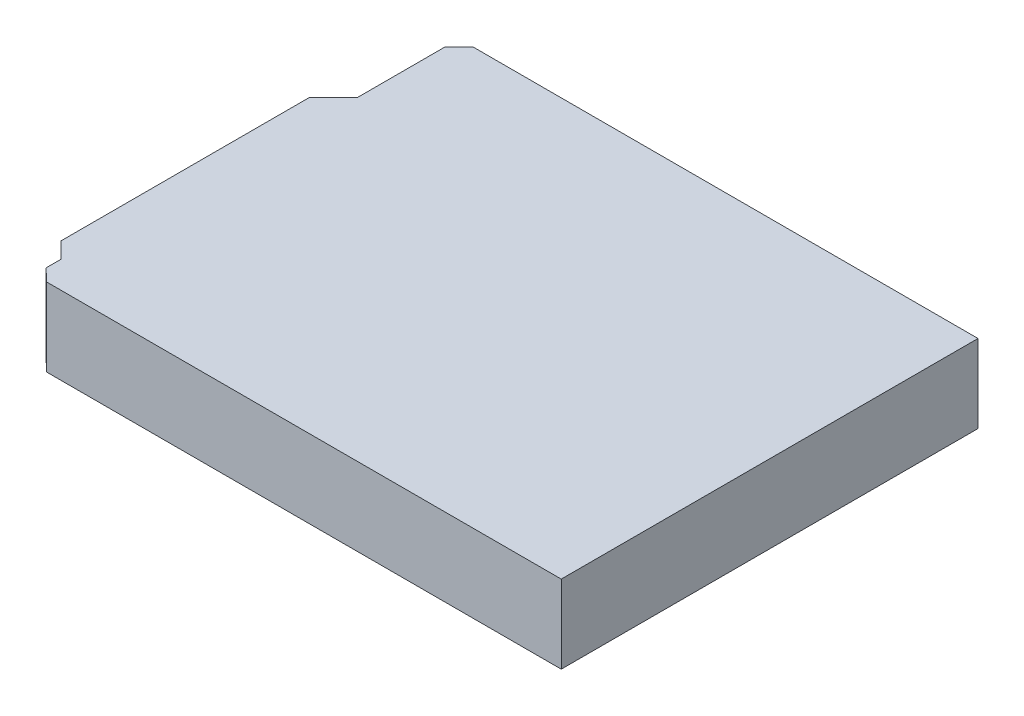
ISO-10303-21;
HEADER;
FILE_DESCRIPTION(('STEP AP214'),'2;1');
FILE_NAME('part.step','',(''),(''),'','','');
FILE_SCHEMA(('AUTOMOTIVE_DESIGN { 1 0 10303 214 1 1 1 1 }'));
ENDSEC;
DATA;
#1=APPLICATION_CONTEXT('core data for automotive mechanical design processes');
#2=APPLICATION_PROTOCOL_DEFINITION('international standard','automotive_design',2000,#1);
#3=PRODUCT_CONTEXT('',#1,'mechanical');
#4=PRODUCT('Part','Part','',(#3));
#5=PRODUCT_RELATED_PRODUCT_CATEGORY('part','',(#4));
#6=PRODUCT_DEFINITION_FORMATION('','',#4);
#7=PRODUCT_DEFINITION_CONTEXT('part definition',#1,'design');
#8=PRODUCT_DEFINITION('design','',#6,#7);
#9=PRODUCT_DEFINITION_SHAPE('','',#8);
#10=(LENGTH_UNIT() NAMED_UNIT(*) SI_UNIT(.MILLI.,.METRE.));
#11=(NAMED_UNIT(*) PLANE_ANGLE_UNIT() SI_UNIT($,.RADIAN.));
#12=(NAMED_UNIT(*) SI_UNIT($,.STERADIAN.) SOLID_ANGLE_UNIT());
#13=UNCERTAINTY_MEASURE_WITH_UNIT(LENGTH_MEASURE(1.E-05),#10,'distance_accuracy_value','');
#14=(GEOMETRIC_REPRESENTATION_CONTEXT(3) GLOBAL_UNCERTAINTY_ASSIGNED_CONTEXT((#13)) GLOBAL_UNIT_ASSIGNED_CONTEXT((#10,
#11,#12)) REPRESENTATION_CONTEXT('',''));
#15=CARTESIAN_POINT('',(0.,0.,0.));
#16=DIRECTION('',(0.,0.,1.));
#17=DIRECTION('',(1.,0.,0.));
#18=AXIS2_PLACEMENT_3D('',#15,#16,#17);
#19=CARTESIAN_POINT('',(36.1388085609712,10.,-26.2585108376787));
#20=DIRECTION('',(0.,0.,1.));
#21=DIRECTION('',(1.,0.,0.));
#22=AXIS2_PLACEMENT_3D('',#19,#20,#21);
#23=PLANE('',#22);
#24=DIRECTION('',(-1.,0.,0.));
#25=VECTOR('',#24,1.);
#26=CARTESIAN_POINT('',(36.1388085609712,0.,-26.2585108376787));
#27=LINE('',#26,#25);
#28=CARTESIAN_POINT('',(36.1388085609712,0.,-26.2585108376787));
#29=VERTEX_POINT('',#28);
#30=CARTESIAN_POINT('',(-28.5911914390288,0.,-26.2585108376787));
#31=VERTEX_POINT('',#30);
#32=EDGE_CURVE('E141',#29,#31,#27,.T.);
#33=ORIENTED_EDGE('',*,*,#32,.T.);
#34=DIRECTION('',(0.,-1.,0.));
#35=VECTOR('',#34,1.);
#36=CARTESIAN_POINT('',(-28.5911914390288,10.,-26.2585108376787));
#37=LINE('',#36,#35);
#38=CARTESIAN_POINT('',(-28.5911914390288,10.,-26.2585108376787));
#39=VERTEX_POINT('',#38);
#40=EDGE_CURVE('E11',#39,#31,#37,.T.);
#41=ORIENTED_EDGE('',*,*,#40,.F.);
#42=DIRECTION('',(-1.,0.,0.));
#43=VECTOR('',#42,1.);
#44=CARTESIAN_POINT('',(36.1388085609712,10.,-26.2585108376787));
#45=LINE('',#44,#43);
#46=CARTESIAN_POINT('',(36.1388085609712,10.,-26.2585108376787));
#47=VERTEX_POINT('',#46);
#48=EDGE_CURVE('E159',#47,#39,#45,.T.);
#49=ORIENTED_EDGE('',*,*,#48,.F.);
#50=DIRECTION('',(0.,-1.,0.));
#51=VECTOR('',#50,1.);
#52=CARTESIAN_POINT('',(36.1388085609712,10.,-26.2585108376787));
#53=LINE('',#52,#51);
#54=EDGE_CURVE('E137',#47,#29,#53,.T.);
#55=ORIENTED_EDGE('',*,*,#54,.T.);
#56=EDGE_LOOP('',(#33,#41,#49,#55));
#57=FACE_BOUND('',#56,.T.);
#58=ADVANCED_FACE('F33',(#57),#23,.F.);
#59=CARTESIAN_POINT('',(-28.5911914390288,10.,-26.2585108376787));
#60=DIRECTION('',(0.707106781186549,0.,0.707106781186546));
#61=DIRECTION('',(0.707106781186546,0.,-0.707106781186549));
#62=AXIS2_PLACEMENT_3D('',#59,#60,#61);
#63=PLANE('',#62);
#64=DIRECTION('',(-0.707106781186546,0.,0.707106781186549));
#65=VECTOR('',#64,1.);
#66=CARTESIAN_POINT('',(-28.5911914390288,0.,-26.2585108376787));
#67=LINE('',#66,#65);
#68=CARTESIAN_POINT('',(-30.3589583919951,0.,-24.4907438847124));
#69=VERTEX_POINT('',#68);
#70=EDGE_CURVE('E144',#31,#69,#67,.T.);
#71=ORIENTED_EDGE('',*,*,#70,.T.);
#72=DIRECTION('',(0.,-1.,0.));
#73=VECTOR('',#72,1.);
#74=CARTESIAN_POINT('',(-30.3589583919951,10.,-24.4907438847124));
#75=LINE('',#74,#73);
#76=CARTESIAN_POINT('',(-30.3589583919951,10.,-24.4907438847124));
#77=VERTEX_POINT('',#76);
#78=EDGE_CURVE('E41',#77,#69,#75,.T.);
#79=ORIENTED_EDGE('',*,*,#78,.F.);
#80=DIRECTION('',(-0.707106781186546,0.,0.707106781186549));
#81=VECTOR('',#80,1.);
#82=CARTESIAN_POINT('',(-28.5911914390288,10.,-26.2585108376787));
#83=LINE('',#82,#81);
#84=EDGE_CURVE('E98',#39,#77,#83,.T.);
#85=ORIENTED_EDGE('',*,*,#84,.F.);
#86=ORIENTED_EDGE('',*,*,#40,.T.);
#87=EDGE_LOOP('',(#71,#79,#85,#86));
#88=FACE_BOUND('',#87,.T.);
#89=ADVANCED_FACE('F208',(#88),#63,.F.);
#90=CARTESIAN_POINT('',(-30.3589583919951,10.,-24.4907438847124));
#91=DIRECTION('',(1.,0.,0.));
#92=DIRECTION('',(0.,0.,-1.));
#93=AXIS2_PLACEMENT_3D('',#90,#91,#92);
#94=PLANE('',#93);
#95=DIRECTION('',(0.,0.,1.));
#96=VECTOR('',#95,1.);
#97=CARTESIAN_POINT('',(-30.3589583919951,0.,-24.4907438847124));
#98=LINE('',#97,#96);
#99=CARTESIAN_POINT('',(-30.3589583919951,0.,-13.2607438847124));
#100=VERTEX_POINT('',#99);
#101=EDGE_CURVE('E146',#69,#100,#98,.T.);
#102=ORIENTED_EDGE('',*,*,#101,.T.);
#103=DIRECTION('',(0.,-1.,0.));
#104=VECTOR('',#103,1.);
#105=CARTESIAN_POINT('',(-30.3589583919951,10.,-13.2607438847124));
#106=LINE('',#105,#104);
#107=CARTESIAN_POINT('',(-30.3589583919951,10.,-13.2607438847124));
#108=VERTEX_POINT('',#107);
#109=EDGE_CURVE('E172',#108,#100,#106,.T.);
#110=ORIENTED_EDGE('',*,*,#109,.F.);
#111=DIRECTION('',(0.,0.,1.));
#112=VECTOR('',#111,1.);
#113=CARTESIAN_POINT('',(-30.3589583919951,10.,-24.4907438847124));
#114=LINE('',#113,#112);
#115=EDGE_CURVE('E180',#77,#108,#114,.T.);
#116=ORIENTED_EDGE('',*,*,#115,.F.);
#117=ORIENTED_EDGE('',*,*,#78,.T.);
#118=EDGE_LOOP('',(#102,#110,#116,#117));
#119=FACE_BOUND('',#118,.T.);
#120=ADVANCED_FACE('F178',(#119),#94,.F.);
#121=CARTESIAN_POINT('',(-30.3589583919951,10.,-13.2607438847124));
#122=DIRECTION('',(0.707106781186547,0.,0.707106781186548));
#123=DIRECTION('',(0.707106781186548,0.,-0.707106781186547));
#124=AXIS2_PLACEMENT_3D('',#121,#122,#123);
#125=PLANE('',#124);
#126=DIRECTION('',(-0.707106781186548,0.,0.707106781186547));
#127=VECTOR('',#126,1.);
#128=CARTESIAN_POINT('',(-30.3589583919951,0.,-13.2607438847124));
#129=LINE('',#128,#127);
#130=CARTESIAN_POINT('',(-33.4419439579685,0.,-10.177758318739));
#131=VERTEX_POINT('',#130);
#132=EDGE_CURVE('E148',#100,#131,#129,.T.);
#133=ORIENTED_EDGE('',*,*,#132,.T.);
#134=DIRECTION('',(0.,-1.,0.));
#135=VECTOR('',#134,1.);
#136=CARTESIAN_POINT('',(-33.4419439579685,10.,-10.177758318739));
#137=LINE('',#136,#135);
#138=CARTESIAN_POINT('',(-33.4419439579685,10.,-10.177758318739));
#139=VERTEX_POINT('',#138);
#140=EDGE_CURVE('E169',#139,#131,#137,.T.);
#141=ORIENTED_EDGE('',*,*,#140,.F.);
#142=DIRECTION('',(-0.707106781186548,0.,0.707106781186547));
#143=VECTOR('',#142,1.);
#144=CARTESIAN_POINT('',(-30.3589583919951,10.,-13.2607438847124));
#145=LINE('',#144,#143);
#146=EDGE_CURVE('E198',#108,#139,#145,.T.);
#147=ORIENTED_EDGE('',*,*,#146,.F.);
#148=ORIENTED_EDGE('',*,*,#109,.T.);
#149=EDGE_LOOP('',(#133,#141,#147,#148));
#150=FACE_BOUND('',#149,.T.);
#151=ADVANCED_FACE('F189',(#150),#125,.F.);
#152=CARTESIAN_POINT('',(-33.4419439579685,10.,-10.177758318739));
#153=DIRECTION('',(1.,0.,0.));
#154=DIRECTION('',(0.,0.,-1.));
#155=AXIS2_PLACEMENT_3D('',#152,#153,#154);
#156=PLANE('',#155);
#157=DIRECTION('',(0.,0.,1.));
#158=VECTOR('',#157,1.);
#159=CARTESIAN_POINT('',(-33.4419439579685,0.,-10.177758318739));
#160=LINE('',#159,#158);
#161=CARTESIAN_POINT('',(-33.4419439579685,0.,21.652241681261));
#162=VERTEX_POINT('',#161);
#163=EDGE_CURVE('E150',#131,#162,#160,.T.);
#164=ORIENTED_EDGE('',*,*,#163,.T.);
#165=DIRECTION('',(0.,-1.,0.));
#166=VECTOR('',#165,1.);
#167=CARTESIAN_POINT('',(-33.4419439579685,10.,21.652241681261));
#168=LINE('',#167,#166);
#169=CARTESIAN_POINT('',(-33.4419439579685,10.,21.652241681261));
#170=VERTEX_POINT('',#169);
#171=EDGE_CURVE('E166',#170,#162,#168,.T.);
#172=ORIENTED_EDGE('',*,*,#171,.F.);
#173=DIRECTION('',(0.,0.,1.));
#174=VECTOR('',#173,1.);
#175=CARTESIAN_POINT('',(-33.4419439579685,10.,-10.177758318739));
#176=LINE('',#175,#174);
#177=EDGE_CURVE('E195',#139,#170,#176,.T.);
#178=ORIENTED_EDGE('',*,*,#177,.F.);
#179=ORIENTED_EDGE('',*,*,#140,.T.);
#180=EDGE_LOOP('',(#164,#172,#178,#179));
#181=FACE_BOUND('',#180,.T.);
#182=ADVANCED_FACE('F193',(#181),#156,.F.);
#183=CARTESIAN_POINT('',(-33.4419439579685,10.,21.652241681261));
#184=DIRECTION('',(0.707106781186548,0.,-0.707106781186548));
#185=DIRECTION('',(-0.707106781186548,0.,-0.707106781186548));
#186=AXIS2_PLACEMENT_3D('',#183,#184,#185);
#187=PLANE('',#186);
#188=DIRECTION('',(0.707106781186547,0.,0.707106781186547));
#189=VECTOR('',#188,1.);
#190=CARTESIAN_POINT('',(-33.4419439579685,0.,21.652241681261));
#191=LINE('',#190,#189);
#192=CARTESIAN_POINT('',(-31.401418563923,0.,23.6927670753065));
#193=VERTEX_POINT('',#192);
#194=EDGE_CURVE('E152',#162,#193,#191,.T.);
#195=ORIENTED_EDGE('',*,*,#194,.T.);
#196=DIRECTION('',(0.,-1.,0.));
#197=VECTOR('',#196,1.);
#198=CARTESIAN_POINT('',(-31.401418563923,10.,23.6927670753065));
#199=LINE('',#198,#197);
#200=CARTESIAN_POINT('',(-31.401418563923,10.,23.6927670753065));
#201=VERTEX_POINT('',#200);
#202=EDGE_CURVE('E163',#201,#193,#199,.T.);
#203=ORIENTED_EDGE('',*,*,#202,.F.);
#204=DIRECTION('',(0.707106781186547,0.,0.707106781186547));
#205=VECTOR('',#204,1.);
#206=CARTESIAN_POINT('',(-33.4419439579685,10.,21.652241681261));
#207=LINE('',#206,#205);
#208=EDGE_CURVE('E197',#170,#201,#207,.T.);
#209=ORIENTED_EDGE('',*,*,#208,.F.);
#210=ORIENTED_EDGE('',*,*,#171,.T.);
#211=EDGE_LOOP('',(#195,#203,#209,#210));
#212=FACE_BOUND('',#211,.T.);
#213=ADVANCED_FACE('F220',(#212),#187,.F.);
#214=CARTESIAN_POINT('',(-31.401418563923,10.,23.6927670753065));
#215=DIRECTION('',(1.,0.,0.));
#216=DIRECTION('',(0.,0.,-1.));
#217=AXIS2_PLACEMENT_3D('',#214,#215,#216);
#218=PLANE('',#217);
#219=DIRECTION('',(0.,0.,1.));
#220=VECTOR('',#219,1.);
#221=CARTESIAN_POINT('',(-31.401418563923,0.,23.6927670753065));
#222=LINE('',#221,#220);
#223=CARTESIAN_POINT('',(-31.401418563923,0.,25.6227670753065));
#224=VERTEX_POINT('',#223);
#225=EDGE_CURVE('E154',#193,#224,#222,.T.);
#226=ORIENTED_EDGE('',*,*,#225,.T.);
#227=DIRECTION('',(0.,-1.,0.));
#228=VECTOR('',#227,1.);
#229=CARTESIAN_POINT('',(-31.401418563923,10.,25.6227670753065));
#230=LINE('',#229,#228);
#231=CARTESIAN_POINT('',(-31.401418563923,10.,25.6227670753065));
#232=VERTEX_POINT('',#231);
#233=EDGE_CURVE('E132',#232,#224,#230,.T.);
#234=ORIENTED_EDGE('',*,*,#233,.F.);
#235=DIRECTION('',(0.,0.,1.));
#236=VECTOR('',#235,1.);
#237=CARTESIAN_POINT('',(-31.401418563923,10.,23.6927670753065));
#238=LINE('',#237,#236);
#239=EDGE_CURVE('E123',#201,#232,#238,.T.);
#240=ORIENTED_EDGE('',*,*,#239,.F.);
#241=ORIENTED_EDGE('',*,*,#202,.T.);
#242=EDGE_LOOP('',(#226,#234,#240,#241));
#243=FACE_BOUND('',#242,.T.);
#244=ADVANCED_FACE('F223',(#243),#218,.F.);
#245=CARTESIAN_POINT('',(-31.401418563923,10.,25.6227670753065));
#246=DIRECTION('',(0.68613434242745,0.,-0.727474854645609));
#247=DIRECTION('',(-0.727474854645609,0.,-0.68613434242745));
#248=AXIS2_PLACEMENT_3D('',#245,#246,#247);
#249=PLANE('',#248);
#250=DIRECTION('',(0.72747485464561,0.,0.68613434242745));
#251=VECTOR('',#250,1.);
#252=CARTESIAN_POINT('',(-31.401418563923,0.,25.6227670753065));
#253=LINE('',#252,#251);
#254=CARTESIAN_POINT('',(-29.7911914390288,0.,27.1414891623212));
#255=VERTEX_POINT('',#254);
#256=EDGE_CURVE('E131',#224,#255,#253,.T.);
#257=ORIENTED_EDGE('',*,*,#256,.T.);
#258=DIRECTION('',(0.,-1.,0.));
#259=VECTOR('',#258,1.);
#260=CARTESIAN_POINT('',(-29.7911914390288,10.,27.1414891623212));
#261=LINE('',#260,#259);
#262=CARTESIAN_POINT('',(-29.7911914390288,10.,27.1414891623212));
#263=VERTEX_POINT('',#262);
#264=EDGE_CURVE('E128',#263,#255,#261,.T.);
#265=ORIENTED_EDGE('',*,*,#264,.F.);
#266=DIRECTION('',(0.72747485464561,0.,0.68613434242745));
#267=VECTOR('',#266,1.);
#268=CARTESIAN_POINT('',(-31.401418563923,10.,25.6227670753065));
#269=LINE('',#268,#267);
#270=EDGE_CURVE('E117',#232,#263,#269,.T.);
#271=ORIENTED_EDGE('',*,*,#270,.F.);
#272=ORIENTED_EDGE('',*,*,#233,.T.);
#273=EDGE_LOOP('',(#257,#265,#271,#272));
#274=FACE_BOUND('',#273,.T.);
#275=ADVANCED_FACE('F129',(#274),#249,.F.);
#276=CARTESIAN_POINT('',(-29.7911914390288,10.,27.1414891623212));
#277=DIRECTION('',(0.,0.,-1.));
#278=DIRECTION('',(-1.,0.,0.));
#279=AXIS2_PLACEMENT_3D('',#276,#277,#278);
#280=PLANE('',#279);
#281=DIRECTION('',(1.,0.,0.));
#282=VECTOR('',#281,1.);
#283=CARTESIAN_POINT('',(-29.7911914390288,0.,27.1414891623212));
#284=LINE('',#283,#282);
#285=CARTESIAN_POINT('',(36.1388085609712,0.,27.1414891623213));
#286=VERTEX_POINT('',#285);
#287=EDGE_CURVE('E84',#255,#286,#284,.T.);
#288=ORIENTED_EDGE('',*,*,#287,.T.);
#289=DIRECTION('',(0.,-1.,0.));
#290=VECTOR('',#289,1.);
#291=CARTESIAN_POINT('',(36.1388085609712,10.,27.1414891623213));
#292=LINE('',#291,#290);
#293=CARTESIAN_POINT('',(36.1388085609712,10.,27.1414891623213));
#294=VERTEX_POINT('',#293);
#295=EDGE_CURVE('E133',#294,#286,#292,.T.);
#296=ORIENTED_EDGE('',*,*,#295,.F.);
#297=DIRECTION('',(1.,0.,0.));
#298=VECTOR('',#297,1.);
#299=CARTESIAN_POINT('',(-29.7911914390288,10.,27.1414891623212));
#300=LINE('',#299,#298);
#301=EDGE_CURVE('E121',#263,#294,#300,.T.);
#302=ORIENTED_EDGE('',*,*,#301,.F.);
#303=ORIENTED_EDGE('',*,*,#264,.T.);
#304=EDGE_LOOP('',(#288,#296,#302,#303));
#305=FACE_BOUND('',#304,.T.);
#306=ADVANCED_FACE('F135',(#305),#280,.F.);
#307=CARTESIAN_POINT('',(36.1388085609712,10.,27.1414891623213));
#308=DIRECTION('',(-1.,0.,0.));
#309=DIRECTION('',(0.,0.,1.));
#310=AXIS2_PLACEMENT_3D('',#307,#308,#309);
#311=PLANE('',#310);
#312=DIRECTION('',(0.,0.,-1.));
#313=VECTOR('',#312,1.);
#314=CARTESIAN_POINT('',(36.1388085609712,0.,27.1414891623213));
#315=LINE('',#314,#313);
#316=EDGE_CURVE('E90',#286,#29,#315,.T.);
#317=ORIENTED_EDGE('',*,*,#316,.T.);
#318=ORIENTED_EDGE('',*,*,#54,.F.);
#319=DIRECTION('',(0.,0.,-1.));
#320=VECTOR('',#319,1.);
#321=CARTESIAN_POINT('',(36.1388085609712,10.,27.1414891623213));
#322=LINE('',#321,#320);
#323=EDGE_CURVE('E49',#294,#47,#322,.T.);
#324=ORIENTED_EDGE('',*,*,#323,.F.);
#325=ORIENTED_EDGE('',*,*,#295,.T.);
#326=EDGE_LOOP('',(#317,#318,#324,#325));
#327=FACE_BOUND('',#326,.T.);
#328=ADVANCED_FACE('F232',(#327),#311,.F.);
#329=CARTESIAN_POINT('',(0.,10.,0.));
#330=DIRECTION('',(0.,1.,0.));
#331=DIRECTION('',(0.,0.,1.));
#332=AXIS2_PLACEMENT_3D('',#329,#330,#331);
#333=PLANE('',#332);
#334=ORIENTED_EDGE('',*,*,#48,.T.);
#335=ORIENTED_EDGE('',*,*,#84,.T.);
#336=ORIENTED_EDGE('',*,*,#115,.T.);
#337=ORIENTED_EDGE('',*,*,#146,.T.);
#338=ORIENTED_EDGE('',*,*,#177,.T.);
#339=ORIENTED_EDGE('',*,*,#208,.T.);
#340=ORIENTED_EDGE('',*,*,#239,.T.);
#341=ORIENTED_EDGE('',*,*,#270,.T.);
#342=ORIENTED_EDGE('',*,*,#301,.T.);
#343=ORIENTED_EDGE('',*,*,#323,.T.);
#344=EDGE_LOOP('',(#334,#335,#336,#337,#338,#339,#340,#341,#342,#343));
#345=FACE_BOUND('',#344,.T.);
#346=ADVANCED_FACE('F119',(#345),#333,.T.);
#347=CARTESIAN_POINT('',(0.,0.,0.));
#348=DIRECTION('',(0.,1.,0.));
#349=DIRECTION('',(0.,0.,1.));
#350=AXIS2_PLACEMENT_3D('',#347,#348,#349);
#351=PLANE('',#350);
#352=ORIENTED_EDGE('',*,*,#32,.F.);
#353=ORIENTED_EDGE('',*,*,#316,.F.);
#354=ORIENTED_EDGE('',*,*,#287,.F.);
#355=ORIENTED_EDGE('',*,*,#256,.F.);
#356=ORIENTED_EDGE('',*,*,#225,.F.);
#357=ORIENTED_EDGE('',*,*,#194,.F.);
#358=ORIENTED_EDGE('',*,*,#163,.F.);
#359=ORIENTED_EDGE('',*,*,#132,.F.);
#360=ORIENTED_EDGE('',*,*,#101,.F.);
#361=ORIENTED_EDGE('',*,*,#70,.F.);
#362=EDGE_LOOP('',(#352,#353,#354,#355,#356,#357,#358,#359,#360,#361));
#363=FACE_BOUND('',#362,.T.);
#364=ADVANCED_FACE('F184',(#363),#351,.F.);
#365=CLOSED_SHELL('',(#58,#89,#120,#151,#182,#213,#244,#275,#306,#328,#346,#364));
#366=MANIFOLD_SOLID_BREP('B2',#365);
#367=ADVANCED_BREP_SHAPE_REPRESENTATION('',(#18,#366),#14);
#368=SHAPE_DEFINITION_REPRESENTATION(#9,#367);
ENDSEC;
END-ISO-10303-21;
